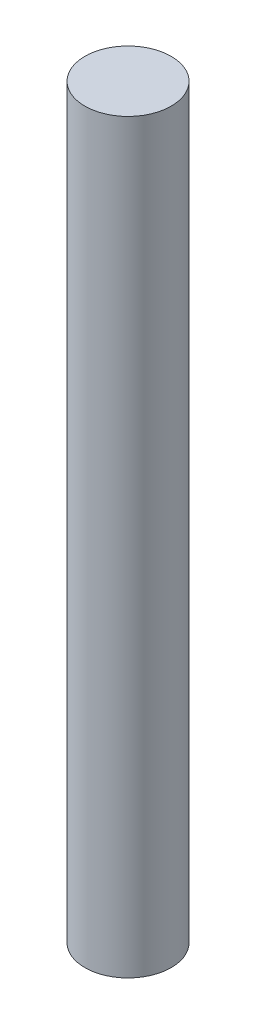
ISO-10303-21;
HEADER;
FILE_DESCRIPTION(('STEP AP214'),'2;1');
FILE_NAME('part.step','',(''),(''),'','','');
FILE_SCHEMA(('AUTOMOTIVE_DESIGN { 1 0 10303 214 1 1 1 1 }'));
ENDSEC;
DATA;
#1=APPLICATION_CONTEXT('core data for automotive mechanical design processes');
#2=APPLICATION_PROTOCOL_DEFINITION('international standard','automotive_design',2000,#1);
#3=PRODUCT_CONTEXT('',#1,'mechanical');
#4=PRODUCT('Part','Part','',(#3));
#5=PRODUCT_RELATED_PRODUCT_CATEGORY('part','',(#4));
#6=PRODUCT_DEFINITION_FORMATION('','',#4);
#7=PRODUCT_DEFINITION_CONTEXT('part definition',#1,'design');
#8=PRODUCT_DEFINITION('design','',#6,#7);
#9=PRODUCT_DEFINITION_SHAPE('','',#8);
#10=(LENGTH_UNIT() NAMED_UNIT(*) SI_UNIT(.MILLI.,.METRE.));
#11=(NAMED_UNIT(*) PLANE_ANGLE_UNIT() SI_UNIT($,.RADIAN.));
#12=(NAMED_UNIT(*) SI_UNIT($,.STERADIAN.) SOLID_ANGLE_UNIT());
#13=UNCERTAINTY_MEASURE_WITH_UNIT(LENGTH_MEASURE(1.E-05),#10,'distance_accuracy_value','');
#14=(GEOMETRIC_REPRESENTATION_CONTEXT(3) GLOBAL_UNCERTAINTY_ASSIGNED_CONTEXT((#13)) GLOBAL_UNIT_ASSIGNED_CONTEXT((#10,
#11,#12)) REPRESENTATION_CONTEXT('',''));
#15=CARTESIAN_POINT('',(0.,0.,0.));
#16=DIRECTION('',(0.,0.,1.));
#17=DIRECTION('',(1.,0.,0.));
#18=AXIS2_PLACEMENT_3D('',#15,#16,#17);
#19=CARTESIAN_POINT('',(0.,12.53,0.));
#20=DIRECTION('',(0.,-1.,0.));
#21=DIRECTION('',(0.,0.,-1.));
#22=AXIS2_PLACEMENT_3D('',#19,#20,#21);
#23=CYLINDRICAL_SURFACE('',#22,0.725);
#24=CARTESIAN_POINT('',(0.,12.53,0.));
#25=DIRECTION('',(0.,1.,0.));
#26=DIRECTION('',(0.,0.,1.));
#27=AXIS2_PLACEMENT_3D('',#24,#25,#26);
#28=CIRCLE('',#27,0.725);
#29=CARTESIAN_POINT('',(0.,12.53,-0.725));
#30=VERTEX_POINT('',#29);
#31=EDGE_CURVE('E10',#30,#30,#28,.T.);
#32=CARTESIAN_POINT('',(0.,0.,0.));
#33=DIRECTION('',(0.,1.,0.));
#34=DIRECTION('',(0.,0.,1.));
#35=AXIS2_PLACEMENT_3D('',#32,#33,#34);
#36=CIRCLE('',#35,0.725);
#37=CARTESIAN_POINT('',(0.,0.,-0.725));
#38=VERTEX_POINT('',#37);
#39=EDGE_CURVE('E46',#38,#38,#36,.T.);
#40=CARTESIAN_POINT('',(0.,12.53,-0.725));
#41=CARTESIAN_POINT('',(0.,12.3994791666667,-0.725));
#42=CARTESIAN_POINT('',(0.,12.2689583333333,-0.725));
#43=CARTESIAN_POINT('',(0.,12.0079166666667,-0.725));
#44=CARTESIAN_POINT('',(0.,11.8773958333333,-0.725));
#45=CARTESIAN_POINT('',(0.,11.6163541666667,-0.725));
#46=CARTESIAN_POINT('',(0.,11.4858333333333,-0.725));
#47=CARTESIAN_POINT('',(0.,11.2247916666667,-0.725));
#48=CARTESIAN_POINT('',(0.,11.0942708333333,-0.725));
#49=CARTESIAN_POINT('',(0.,10.8332291666667,-0.725));
#50=CARTESIAN_POINT('',(0.,10.7027083333333,-0.725));
#51=CARTESIAN_POINT('',(0.,10.4416666666667,-0.725));
#52=CARTESIAN_POINT('',(0.,10.3111458333333,-0.725));
#53=CARTESIAN_POINT('',(0.,10.0501041666667,-0.725));
#54=CARTESIAN_POINT('',(0.,9.91958333333333,-0.725));
#55=CARTESIAN_POINT('',(0.,9.65854166666666,-0.725));
#56=CARTESIAN_POINT('',(0.,9.52802083333333,-0.725));
#57=CARTESIAN_POINT('',(0.,9.26697916666667,-0.725));
#58=CARTESIAN_POINT('',(0.,9.13645833333333,-0.725));
#59=CARTESIAN_POINT('',(0.,8.87541666666666,-0.725));
#60=CARTESIAN_POINT('',(0.,8.74489583333333,-0.725));
#61=CARTESIAN_POINT('',(0.,8.48385416666667,-0.725));
#62=CARTESIAN_POINT('',(0.,8.35333333333333,-0.725));
#63=CARTESIAN_POINT('',(0.,8.09229166666667,-0.725));
#64=CARTESIAN_POINT('',(0.,7.96177083333333,-0.725));
#65=CARTESIAN_POINT('',(0.,7.70072916666666,-0.725));
#66=CARTESIAN_POINT('',(0.,7.57020833333333,-0.725));
#67=CARTESIAN_POINT('',(0.,7.30916666666667,-0.725));
#68=CARTESIAN_POINT('',(0.,7.17864583333333,-0.725));
#69=CARTESIAN_POINT('',(0.,6.91760416666667,-0.725));
#70=CARTESIAN_POINT('',(0.,6.78708333333333,-0.725));
#71=CARTESIAN_POINT('',(0.,6.52604166666667,-0.725));
#72=CARTESIAN_POINT('',(0.,6.39552083333333,-0.725));
#73=CARTESIAN_POINT('',(0.,6.13447916666667,-0.725));
#74=CARTESIAN_POINT('',(0.,6.00395833333333,-0.725));
#75=CARTESIAN_POINT('',(0.,5.74291666666666,-0.725));
#76=CARTESIAN_POINT('',(0.,5.61239583333333,-0.725));
#77=CARTESIAN_POINT('',(0.,5.35135416666667,-0.725));
#78=CARTESIAN_POINT('',(0.,5.22083333333333,-0.725));
#79=CARTESIAN_POINT('',(0.,4.95979166666667,-0.725));
#80=CARTESIAN_POINT('',(0.,4.82927083333333,-0.725));
#81=CARTESIAN_POINT('',(0.,4.56822916666667,-0.725));
#82=CARTESIAN_POINT('',(0.,4.43770833333333,-0.725));
#83=CARTESIAN_POINT('',(0.,4.17666666666666,-0.725));
#84=CARTESIAN_POINT('',(0.,4.04614583333333,-0.725));
#85=CARTESIAN_POINT('',(0.,3.78510416666667,-0.725));
#86=CARTESIAN_POINT('',(0.,3.65458333333333,-0.725));
#87=CARTESIAN_POINT('',(0.,3.39354166666667,-0.725));
#88=CARTESIAN_POINT('',(0.,3.26302083333333,-0.725));
#89=CARTESIAN_POINT('',(0.,3.00197916666666,-0.725));
#90=CARTESIAN_POINT('',(0.,2.87145833333333,-0.725));
#91=CARTESIAN_POINT('',(0.,2.61041666666667,-0.725));
#92=CARTESIAN_POINT('',(0.,2.47989583333333,-0.725));
#93=CARTESIAN_POINT('',(0.,2.21885416666667,-0.725));
#94=CARTESIAN_POINT('',(0.,2.08833333333333,-0.725));
#95=CARTESIAN_POINT('',(0.,1.82729166666667,-0.725));
#96=CARTESIAN_POINT('',(0.,1.69677083333333,-0.725));
#97=CARTESIAN_POINT('',(0.,1.43572916666666,-0.725));
#98=CARTESIAN_POINT('',(0.,1.30520833333333,-0.725));
#99=CARTESIAN_POINT('',(0.,1.04416666666667,-0.725));
#100=CARTESIAN_POINT('',(0.,0.913645833333332,-0.725));
#101=CARTESIAN_POINT('',(0.,0.652604166666665,-0.725));
#102=CARTESIAN_POINT('',(0.,0.522083333333332,-0.725));
#103=CARTESIAN_POINT('',(0.,0.261041666666665,-0.725));
#104=CARTESIAN_POINT('',(0.,0.130520833333331,-0.725));
#105=CARTESIAN_POINT('',(0.,0.,-0.725));
#106=B_SPLINE_CURVE_WITH_KNOTS('',3,(#40,#41,#42,#43,#44,#45,#46,#47,#48,#49,#50,#51,#52,#53,
#54,#55,#56,#57,#58,#59,#60,#61,#62,#63,#64,#65,#66,#67,#68,#69,#70,#71,#72,#73,#74,#75,#76,#77,
#78,#79,#80,#81,#82,#83,#84,#85,#86,#87,#88,#89,#90,#91,#92,#93,#94,#95,#96,#97,#98,#99,#100,
#101,#102,#103,#104,#105),.UNSPECIFIED.,.F.,.F.,(4,2,2,2,2,2,2,2,2,2,2,2,2,2,2,2,2,2,2,2,2,2,2,
2,2,2,2,2,2,2,2,2,4),(0.,0.391562500000001,0.783125000000001,1.1746875,1.56625,1.9578125,
2.349375,2.7409375,3.1325,3.5240625,3.915625,4.3071875,4.69875,5.0903125,5.481875,5.8734375,
6.265,6.6565625,7.048125,7.4396875,7.83125,8.2228125,8.614375,9.0059375,9.3975,9.7890625,
10.180625,10.5721875,10.96375,11.3553125,11.746875,12.1384375,12.53),.UNSPECIFIED.);
#107=EDGE_CURVE('BSEAM43',#30,#38,#106,.T.);
#108=ORIENTED_EDGE('',*,*,#31,.F.);
#109=ORIENTED_EDGE('',*,*,#39,.T.);
#110=ORIENTED_EDGE('',*,*,#107,.T.);
#111=ORIENTED_EDGE('',*,*,#107,.F.);
#112=EDGE_LOOP('',(#108,#110,#109,#111));
#113=FACE_BOUND('',#112,.T.);
#114=ADVANCED_FACE('F43',(#113),#23,.T.);
#115=CARTESIAN_POINT('',(0.,12.53,0.));
#116=DIRECTION('',(0.,1.,0.));
#117=DIRECTION('',(0.,0.,1.));
#118=AXIS2_PLACEMENT_3D('',#115,#116,#117);
#119=PLANE('',#118);
#120=ORIENTED_EDGE('',*,*,#31,.T.);
#121=EDGE_LOOP('',(#120));
#122=FACE_BOUND('',#121,.T.);
#123=ADVANCED_FACE('F60',(#122),#119,.T.);
#124=CARTESIAN_POINT('',(0.,0.,0.));
#125=DIRECTION('',(0.,1.,0.));
#126=DIRECTION('',(0.,0.,1.));
#127=AXIS2_PLACEMENT_3D('',#124,#125,#126);
#128=PLANE('',#127);
#129=ORIENTED_EDGE('',*,*,#39,.F.);
#130=EDGE_LOOP('',(#129));
#131=FACE_BOUND('',#130,.T.);
#132=ADVANCED_FACE('F58',(#131),#128,.F.);
#133=CLOSED_SHELL('',(#114,#123,#132));
#134=MANIFOLD_SOLID_BREP('B2',#133);
#135=ADVANCED_BREP_SHAPE_REPRESENTATION('',(#18,#134),#14);
#136=SHAPE_DEFINITION_REPRESENTATION(#9,#135);
ENDSEC;
END-ISO-10303-21;
